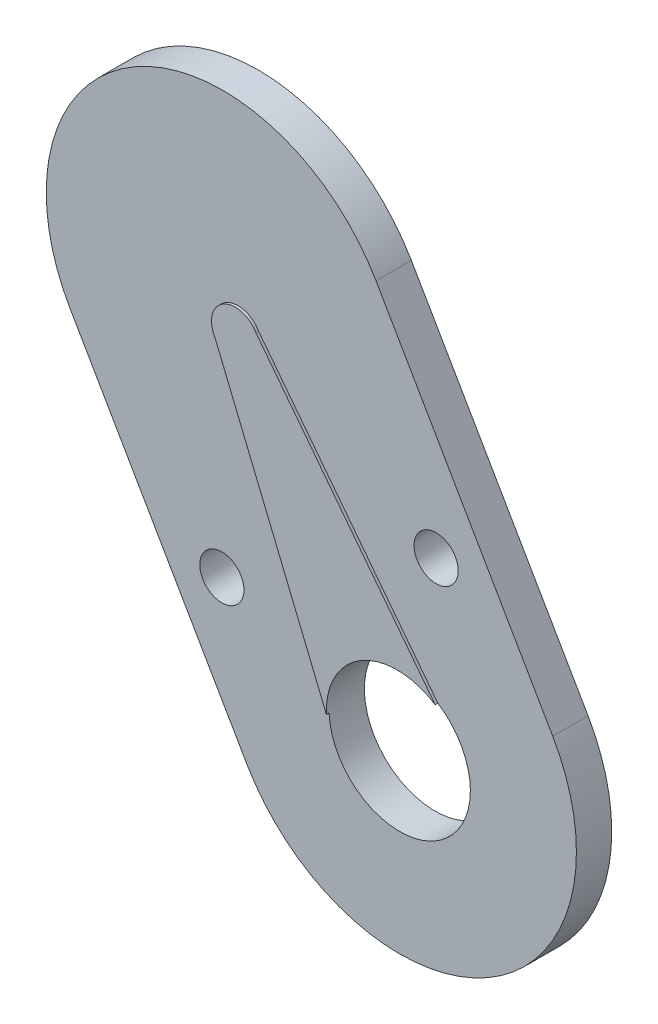
ISO-10303-21;
HEADER;
FILE_DESCRIPTION(('STEP AP214'),'2;1');
FILE_NAME('part.step','',(''),(''),'','','');
FILE_SCHEMA(('AUTOMOTIVE_DESIGN { 1 0 10303 214 1 1 1 1 }'));
ENDSEC;
DATA;
#1=APPLICATION_CONTEXT('core data for automotive mechanical design processes');
#2=APPLICATION_PROTOCOL_DEFINITION('international standard','automotive_design',2000,#1);
#3=PRODUCT_CONTEXT('',#1,'mechanical');
#4=PRODUCT('Part','Part','',(#3));
#5=PRODUCT_RELATED_PRODUCT_CATEGORY('part','',(#4));
#6=PRODUCT_DEFINITION_FORMATION('','',#4);
#7=PRODUCT_DEFINITION_CONTEXT('part definition',#1,'design');
#8=PRODUCT_DEFINITION('design','',#6,#7);
#9=PRODUCT_DEFINITION_SHAPE('','',#8);
#10=(LENGTH_UNIT() NAMED_UNIT(*) SI_UNIT(.MILLI.,.METRE.));
#11=(NAMED_UNIT(*) PLANE_ANGLE_UNIT() SI_UNIT($,.RADIAN.));
#12=(NAMED_UNIT(*) SI_UNIT($,.STERADIAN.) SOLID_ANGLE_UNIT());
#13=UNCERTAINTY_MEASURE_WITH_UNIT(LENGTH_MEASURE(1.E-05),#10,'distance_accuracy_value','');
#14=(GEOMETRIC_REPRESENTATION_CONTEXT(3) GLOBAL_UNCERTAINTY_ASSIGNED_CONTEXT((#13)) GLOBAL_UNIT_ASSIGNED_CONTEXT((#10,
#11,#12)) REPRESENTATION_CONTEXT('',''));
#15=CARTESIAN_POINT('',(0.,0.,0.));
#16=DIRECTION('',(0.,0.,1.));
#17=DIRECTION('',(1.,0.,0.));
#18=AXIS2_PLACEMENT_3D('',#15,#16,#17);
#19=CARTESIAN_POINT('',(3.29089653438087,1.9,0.15));
#20=DIRECTION('',(-0.792019043107697,-0.610496384391233,0.));
#21=DIRECTION('',(0.610496384391233,-0.792019043107697,0.));
#22=AXIS2_PLACEMENT_3D('',#19,#20,#21);
#23=PLANE('',#22);
#24=DIRECTION('',(0.,0.,-1.));
#25=VECTOR('',#24,1.);
#26=CARTESIAN_POINT('',(2.16075186307974,3.36617756308211,0.4));
#27=LINE('',#26,#25);
#28=CARTESIAN_POINT('',(2.16075186307974,3.36617756308211,0.));
#29=VERTEX_POINT('',#28);
#30=CARTESIAN_POINT('',(2.16075186307974,3.36617756308211,0.15));
#31=VERTEX_POINT('',#30);
#32=EDGE_CURVE('E57',#29,#31,#27,.F.);
#33=ORIENTED_EDGE('',*,*,#32,.F.);
#34=DIRECTION('',(-0.610496384391233,0.792019043107697,0.));
#35=VECTOR('',#34,1.);
#36=CARTESIAN_POINT('',(3.29089653438087,1.9,0.));
#37=LINE('',#36,#35);
#38=CARTESIAN_POINT('',(-7.98086570489101,16.5232648892552,0.));
#39=VERTEX_POINT('',#38);
#40=EDGE_CURVE('E129',#29,#39,#37,.T.);
#41=ORIENTED_EDGE('',*,*,#40,.T.);
#42=DIRECTION('',(0.,0.,-1.));
#43=VECTOR('',#42,1.);
#44=CARTESIAN_POINT('',(-7.98086570489101,16.5232648892552,0.15));
#45=LINE('',#44,#43);
#46=CARTESIAN_POINT('',(-7.98086570489101,16.5232648892552,0.15));
#47=VERTEX_POINT('',#46);
#48=EDGE_CURVE('E124',#47,#39,#45,.T.);
#49=ORIENTED_EDGE('',*,*,#48,.F.);
#50=DIRECTION('',(-0.610496384391233,0.792019043107697,0.));
#51=VECTOR('',#50,1.);
#52=CARTESIAN_POINT('',(3.29089653438087,1.9,0.15));
#53=LINE('',#52,#51);
#54=EDGE_CURVE('E125',#31,#47,#53,.T.);
#55=ORIENTED_EDGE('',*,*,#54,.F.);
#56=EDGE_LOOP('',(#33,#41,#49,#55));
#57=FACE_BOUND('',#56,.T.);
#58=ADVANCED_FACE('F39',(#57),#23,.F.);
#59=CARTESIAN_POINT('',(-10.319134295109,15.1732648892552,0.15));
#60=DIRECTION('',(0.924714899355206,0.380660419416691,0.));
#61=DIRECTION('',(-0.380660419416692,0.924714899355206,0.));
#62=AXIS2_PLACEMENT_3D('',#59,#60,#61);
#63=PLANE('',#62);
#64=DIRECTION('',(0.,0.,-1.));
#65=VECTOR('',#64,1.);
#66=CARTESIAN_POINT('',(-3.99557121481817,-0.188177223160556,0.4));
#67=LINE('',#66,#65);
#68=CARTESIAN_POINT('',(-3.99557121481817,-0.188177223160562,0.15));
#69=VERTEX_POINT('',#68);
#70=CARTESIAN_POINT('',(-3.99557121481817,-0.188177223160556,0.));
#71=VERTEX_POINT('',#70);
#72=EDGE_CURVE('E110',#69,#71,#67,.T.);
#73=ORIENTED_EDGE('',*,*,#72,.F.);
#74=DIRECTION('',(0.380660419416691,-0.924714899355206,0.));
#75=VECTOR('',#74,1.);
#76=CARTESIAN_POINT('',(-10.319134295109,15.1732648892552,0.15));
#77=LINE('',#76,#75);
#78=CARTESIAN_POINT('',(-10.319134295109,15.1732648892552,0.15));
#79=VERTEX_POINT('',#78);
#80=EDGE_CURVE('E114',#79,#69,#77,.T.);
#81=ORIENTED_EDGE('',*,*,#80,.F.);
#82=DIRECTION('',(0.,0.,-1.));
#83=VECTOR('',#82,1.);
#84=CARTESIAN_POINT('',(-10.319134295109,15.1732648892552,0.15));
#85=LINE('',#84,#83);
#86=CARTESIAN_POINT('',(-10.319134295109,15.1732648892552,0.));
#87=VERTEX_POINT('',#86);
#88=EDGE_CURVE('E122',#79,#87,#85,.T.);
#89=ORIENTED_EDGE('',*,*,#88,.T.);
#90=DIRECTION('',(0.380660419416691,-0.924714899355206,0.));
#91=VECTOR('',#90,1.);
#92=CARTESIAN_POINT('',(-10.319134295109,15.1732648892552,0.));
#93=LINE('',#92,#91);
#94=EDGE_CURVE('E64',#87,#71,#93,.T.);
#95=ORIENTED_EDGE('',*,*,#94,.T.);
#96=EDGE_LOOP('',(#73,#81,#89,#95));
#97=FACE_BOUND('',#96,.T.);
#98=ADVANCED_FACE('F115',(#97),#63,.F.);
#99=CARTESIAN_POINT('',(0.,0.,0.));
#100=DIRECTION('',(0.,0.,1.));
#101=DIRECTION('',(1.,0.,0.));
#102=AXIS2_PLACEMENT_3D('',#99,#100,#101);
#103=PLANE('',#102);
#104=CARTESIAN_POINT('',(2.06217782649107,10.4282032302755,0.));
#105=DIRECTION('',(0.,0.,1.));
#106=DIRECTION('',(1.,0.,0.));
#107=AXIS2_PLACEMENT_3D('',#104,#105,#106);
#108=CIRCLE('',#107,1.25);
#109=CARTESIAN_POINT('',(3.31217782649107,10.4282032302755,0.));
#110=VERTEX_POINT('',#109);
#111=EDGE_CURVE('E113',#110,#110,#108,.F.);
#112=ORIENTED_EDGE('',*,*,#111,.T.);
#113=EDGE_LOOP('',(#112));
#114=FACE_BOUND('',#113,.T.);
#115=CARTESIAN_POINT('',(-10.0621778264911,3.42820323027551,0.));
#116=DIRECTION('',(0.,0.,1.));
#117=DIRECTION('',(1.,0.,0.));
#118=AXIS2_PLACEMENT_3D('',#115,#116,#117);
#119=CIRCLE('',#118,1.25);
#120=CARTESIAN_POINT('',(-8.81217782649107,3.42820323027551,0.));
#121=VERTEX_POINT('',#120);
#122=EDGE_CURVE('E167',#121,#121,#119,.F.);
#123=ORIENTED_EDGE('',*,*,#122,.T.);
#124=EDGE_LOOP('',(#123));
#125=FACE_BOUND('',#124,.T.);
#126=DIRECTION('',(-0.5,0.866025403784439,0.));
#127=VECTOR('',#126,1.);
#128=CARTESIAN_POINT('',(8.66025403784439,5.,0.));
#129=LINE('',#128,#127);
#130=CARTESIAN_POINT('',(8.66025403784439,5.,0.));
#131=VERTEX_POINT('',#130);
#132=CARTESIAN_POINT('',(-1.33974596215561,22.3205080756888,0.));
#133=VERTEX_POINT('',#132);
#134=EDGE_CURVE('E148',#131,#133,#129,.T.);
#135=ORIENTED_EDGE('',*,*,#134,.T.);
#136=CARTESIAN_POINT('',(-10.,17.3205080756888,0.));
#137=DIRECTION('',(0.,0.,1.));
#138=DIRECTION('',(1.,0.,0.));
#139=AXIS2_PLACEMENT_3D('',#136,#137,#138);
#140=CIRCLE('',#139,10.);
#141=CARTESIAN_POINT('',(-18.6602540378444,12.3205080756888,0.));
#142=VERTEX_POINT('',#141);
#143=EDGE_CURVE('E135',#133,#142,#140,.T.);
#144=ORIENTED_EDGE('',*,*,#143,.T.);
#145=DIRECTION('',(0.5,-0.866025403784439,0.));
#146=VECTOR('',#145,1.);
#147=CARTESIAN_POINT('',(-18.6602540378444,12.3205080756888,0.));
#148=LINE('',#147,#146);
#149=CARTESIAN_POINT('',(-8.66025403784439,-5.,0.));
#150=VERTEX_POINT('',#149);
#151=EDGE_CURVE('E149',#142,#150,#148,.T.);
#152=ORIENTED_EDGE('',*,*,#151,.T.);
#153=CARTESIAN_POINT('',(0.,0.,0.));
#154=DIRECTION('',(0.,0.,1.));
#155=DIRECTION('',(1.,0.,0.));
#156=AXIS2_PLACEMENT_3D('',#153,#154,#155);
#157=CIRCLE('',#156,10.);
#158=EDGE_CURVE('E136',#150,#131,#157,.T.);
#159=ORIENTED_EDGE('',*,*,#158,.T.);
#160=EDGE_LOOP('',(#135,#144,#152,#159));
#161=FACE_BOUND('',#160,.T.);
#162=ORIENTED_EDGE('',*,*,#40,.F.);
#163=CARTESIAN_POINT('',(0.,0.,0.));
#164=DIRECTION('',(0.,0.,1.));
#165=DIRECTION('',(1.,0.,0.));
#166=AXIS2_PLACEMENT_3D('',#163,#164,#165);
#167=CIRCLE('',#166,4.);
#168=EDGE_CURVE('E178',#29,#71,#167,.F.);
#169=ORIENTED_EDGE('',*,*,#168,.T.);
#170=ORIENTED_EDGE('',*,*,#94,.F.);
#171=CARTESIAN_POINT('',(-9.15,15.8482648892552,0.));
#172=DIRECTION('',(0.,0.,1.));
#173=DIRECTION('',(1.,0.,0.));
#174=AXIS2_PLACEMENT_3D('',#171,#172,#173);
#175=CIRCLE('',#174,1.35);
#176=EDGE_CURVE('E181',#39,#87,#175,.T.);
#177=ORIENTED_EDGE('',*,*,#176,.F.);
#178=EDGE_LOOP('',(#162,#169,#170,#177));
#179=FACE_BOUND('',#178,.T.);
#180=ADVANCED_FACE('F188',(#114,#125,#161,#179),#103,.T.);
#181=CARTESIAN_POINT('',(8.66025403784439,5.,0.));
#182=DIRECTION('',(-0.866025403784439,-0.5,0.));
#183=DIRECTION('',(0.5,-0.866025403784439,0.));
#184=AXIS2_PLACEMENT_3D('',#181,#182,#183);
#185=PLANE('',#184);
#186=DIRECTION('',(-0.5,0.866025403784439,0.));
#187=VECTOR('',#186,1.);
#188=CARTESIAN_POINT('',(8.66025403784439,5.,-2.));
#189=LINE('',#188,#187);
#190=CARTESIAN_POINT('',(8.66025403784439,5.,-2.));
#191=VERTEX_POINT('',#190);
#192=CARTESIAN_POINT('',(-1.33974596215561,22.3205080756888,-2.));
#193=VERTEX_POINT('',#192);
#194=EDGE_CURVE('E141',#191,#193,#189,.T.);
#195=ORIENTED_EDGE('',*,*,#194,.T.);
#196=DIRECTION('',(0.,0.,-1.));
#197=VECTOR('',#196,1.);
#198=CARTESIAN_POINT('',(-1.33974596215561,22.3205080756888,0.));
#199=LINE('',#198,#197);
#200=EDGE_CURVE('E161',#133,#193,#199,.T.);
#201=ORIENTED_EDGE('',*,*,#200,.F.);
#202=ORIENTED_EDGE('',*,*,#134,.F.);
#203=DIRECTION('',(0.,0.,-1.));
#204=VECTOR('',#203,1.);
#205=CARTESIAN_POINT('',(8.66025403784439,5.,0.));
#206=LINE('',#205,#204);
#207=EDGE_CURVE('E48',#131,#191,#206,.T.);
#208=ORIENTED_EDGE('',*,*,#207,.T.);
#209=EDGE_LOOP('',(#195,#201,#202,#208));
#210=FACE_BOUND('',#209,.T.);
#211=ADVANCED_FACE('F41',(#210),#185,.F.);
#212=CARTESIAN_POINT('',(-18.6602540378444,12.3205080756888,0.));
#213=DIRECTION('',(0.866025403784439,0.5,0.));
#214=DIRECTION('',(-0.5,0.866025403784439,0.));
#215=AXIS2_PLACEMENT_3D('',#212,#213,#214);
#216=PLANE('',#215);
#217=DIRECTION('',(0.5,-0.866025403784439,0.));
#218=VECTOR('',#217,1.);
#219=CARTESIAN_POINT('',(-18.6602540378444,12.3205080756888,-2.));
#220=LINE('',#219,#218);
#221=CARTESIAN_POINT('',(-18.6602540378444,12.3205080756888,-2.));
#222=VERTEX_POINT('',#221);
#223=CARTESIAN_POINT('',(-8.66025403784439,-5.,-2.));
#224=VERTEX_POINT('',#223);
#225=EDGE_CURVE('E147',#222,#224,#220,.T.);
#226=ORIENTED_EDGE('',*,*,#225,.T.);
#227=DIRECTION('',(0.,0.,-1.));
#228=VECTOR('',#227,1.);
#229=CARTESIAN_POINT('',(-8.66025403784439,-5.,0.));
#230=LINE('',#229,#228);
#231=EDGE_CURVE('E155',#150,#224,#230,.T.);
#232=ORIENTED_EDGE('',*,*,#231,.F.);
#233=ORIENTED_EDGE('',*,*,#151,.F.);
#234=DIRECTION('',(0.,0.,-1.));
#235=VECTOR('',#234,1.);
#236=CARTESIAN_POINT('',(-18.6602540378444,12.3205080756888,0.));
#237=LINE('',#236,#235);
#238=EDGE_CURVE('E158',#142,#222,#237,.T.);
#239=ORIENTED_EDGE('',*,*,#238,.T.);
#240=EDGE_LOOP('',(#226,#232,#233,#239));
#241=FACE_BOUND('',#240,.T.);
#242=ADVANCED_FACE('F213',(#241),#216,.F.);
#243=CARTESIAN_POINT('',(0.,0.,-2.));
#244=DIRECTION('',(0.,0.,1.));
#245=DIRECTION('',(1.,0.,0.));
#246=AXIS2_PLACEMENT_3D('',#243,#244,#245);
#247=PLANE('',#246);
#248=CARTESIAN_POINT('',(2.06217782649107,10.4282032302755,-2.));
#249=DIRECTION('',(0.,0.,1.));
#250=DIRECTION('',(1.,0.,0.));
#251=AXIS2_PLACEMENT_3D('',#248,#249,#250);
#252=CIRCLE('',#251,1.25);
#253=CARTESIAN_POINT('',(3.31217782649107,10.4282032302755,-2.));
#254=VERTEX_POINT('',#253);
#255=EDGE_CURVE('E43',#254,#254,#252,.F.);
#256=ORIENTED_EDGE('',*,*,#255,.F.);
#257=EDGE_LOOP('',(#256));
#258=FACE_BOUND('',#257,.T.);
#259=CARTESIAN_POINT('',(-10.0621778264911,3.42820323027551,-2.));
#260=DIRECTION('',(0.,0.,1.));
#261=DIRECTION('',(1.,0.,0.));
#262=AXIS2_PLACEMENT_3D('',#259,#260,#261);
#263=CIRCLE('',#262,1.25);
#264=CARTESIAN_POINT('',(-8.81217782649107,3.42820323027551,-2.));
#265=VERTEX_POINT('',#264);
#266=EDGE_CURVE('E163',#265,#265,#263,.F.);
#267=ORIENTED_EDGE('',*,*,#266,.F.);
#268=EDGE_LOOP('',(#267));
#269=FACE_BOUND('',#268,.T.);
#270=CARTESIAN_POINT('',(0.,0.,-2.));
#271=DIRECTION('',(0.,0.,1.));
#272=DIRECTION('',(1.,0.,0.));
#273=AXIS2_PLACEMENT_3D('',#270,#271,#272);
#274=CIRCLE('',#273,4.);
#275=CARTESIAN_POINT('',(4.,0.,-2.));
#276=VERTEX_POINT('',#275);
#277=EDGE_CURVE('E176',#276,#276,#274,.F.);
#278=ORIENTED_EDGE('',*,*,#277,.F.);
#279=EDGE_LOOP('',(#278));
#280=FACE_BOUND('',#279,.T.);
#281=ORIENTED_EDGE('',*,*,#225,.F.);
#282=CARTESIAN_POINT('',(-10.,17.3205080756888,-2.));
#283=DIRECTION('',(0.,0.,1.));
#284=DIRECTION('',(1.,0.,0.));
#285=AXIS2_PLACEMENT_3D('',#282,#283,#284);
#286=CIRCLE('',#285,10.);
#287=EDGE_CURVE('E133',#193,#222,#286,.T.);
#288=ORIENTED_EDGE('',*,*,#287,.F.);
#289=ORIENTED_EDGE('',*,*,#194,.F.);
#290=CARTESIAN_POINT('',(0.,0.,-2.));
#291=DIRECTION('',(0.,0.,1.));
#292=DIRECTION('',(1.,0.,0.));
#293=AXIS2_PLACEMENT_3D('',#290,#291,#292);
#294=CIRCLE('',#293,10.);
#295=EDGE_CURVE('E138',#224,#191,#294,.T.);
#296=ORIENTED_EDGE('',*,*,#295,.F.);
#297=EDGE_LOOP('',(#281,#288,#289,#296));
#298=FACE_BOUND('',#297,.T.);
#299=ADVANCED_FACE('F210',(#258,#269,#280,#298),#247,.F.);
#300=CARTESIAN_POINT('',(0.,0.,0.));
#301=DIRECTION('',(0.,0.,-1.));
#302=DIRECTION('',(-1.,0.,0.));
#303=AXIS2_PLACEMENT_3D('',#300,#301,#302);
#304=CYLINDRICAL_SURFACE('',#303,10.);
#305=ORIENTED_EDGE('',*,*,#295,.T.);
#306=ORIENTED_EDGE('',*,*,#207,.F.);
#307=ORIENTED_EDGE('',*,*,#158,.F.);
#308=ORIENTED_EDGE('',*,*,#231,.T.);
#309=EDGE_LOOP('',(#305,#306,#307,#308));
#310=FACE_BOUND('',#309,.T.);
#311=ADVANCED_FACE('F201',(#310),#304,.T.);
#312=CARTESIAN_POINT('',(-10.,17.3205080756888,0.));
#313=DIRECTION('',(0.,0.,-1.));
#314=DIRECTION('',(-1.,0.,0.));
#315=AXIS2_PLACEMENT_3D('',#312,#313,#314);
#316=CYLINDRICAL_SURFACE('',#315,10.);
#317=ORIENTED_EDGE('',*,*,#143,.F.);
#318=ORIENTED_EDGE('',*,*,#200,.T.);
#319=ORIENTED_EDGE('',*,*,#287,.T.);
#320=ORIENTED_EDGE('',*,*,#238,.F.);
#321=EDGE_LOOP('',(#317,#318,#319,#320));
#322=FACE_BOUND('',#321,.T.);
#323=ADVANCED_FACE('F199',(#322),#316,.T.);
#324=CARTESIAN_POINT('',(0.,0.,0.15));
#325=DIRECTION('',(0.,0.,1.));
#326=DIRECTION('',(1.,0.,0.));
#327=AXIS2_PLACEMENT_3D('',#324,#325,#326);
#328=PLANE('',#327);
#329=ORIENTED_EDGE('',*,*,#80,.T.);
#330=CARTESIAN_POINT('',(0.,0.,0.15));
#331=DIRECTION('',(0.,0.,1.));
#332=DIRECTION('',(1.,0.,0.));
#333=AXIS2_PLACEMENT_3D('',#330,#331,#332);
#334=CIRCLE('',#333,4.);
#335=EDGE_CURVE('E11',#69,#31,#334,.F.);
#336=ORIENTED_EDGE('',*,*,#335,.T.);
#337=ORIENTED_EDGE('',*,*,#54,.T.);
#338=CARTESIAN_POINT('',(-9.15,15.8482648892552,0.15));
#339=DIRECTION('',(0.,0.,1.));
#340=DIRECTION('',(1.,0.,0.));
#341=AXIS2_PLACEMENT_3D('',#338,#339,#340);
#342=CIRCLE('',#341,1.35);
#343=EDGE_CURVE('E120',#47,#79,#342,.T.);
#344=ORIENTED_EDGE('',*,*,#343,.T.);
#345=EDGE_LOOP('',(#329,#336,#337,#344));
#346=FACE_BOUND('',#345,.T.);
#347=ADVANCED_FACE('F119',(#346),#328,.T.);
#348=CARTESIAN_POINT('',(-9.15,15.8482648892552,0.15));
#349=DIRECTION('',(0.,0.,-1.));
#350=DIRECTION('',(-1.,0.,0.));
#351=AXIS2_PLACEMENT_3D('',#348,#349,#350);
#352=CYLINDRICAL_SURFACE('',#351,1.35);
#353=ORIENTED_EDGE('',*,*,#176,.T.);
#354=ORIENTED_EDGE('',*,*,#88,.F.);
#355=ORIENTED_EDGE('',*,*,#343,.F.);
#356=ORIENTED_EDGE('',*,*,#48,.T.);
#357=EDGE_LOOP('',(#353,#354,#355,#356));
#358=FACE_BOUND('',#357,.T.);
#359=ADVANCED_FACE('F186',(#358),#352,.T.);
#360=CARTESIAN_POINT('',(0.,0.,0.4));
#361=DIRECTION('',(0.,0.,-1.));
#362=DIRECTION('',(-1.,0.,0.));
#363=AXIS2_PLACEMENT_3D('',#360,#361,#362);
#364=CYLINDRICAL_SURFACE('',#363,4.);
#365=ORIENTED_EDGE('',*,*,#32,.T.);
#366=ORIENTED_EDGE('',*,*,#335,.F.);
#367=ORIENTED_EDGE('',*,*,#72,.T.);
#368=ORIENTED_EDGE('',*,*,#168,.F.);
#369=EDGE_LOOP('',(#365,#366,#367,#368));
#370=FACE_BOUND('',#369,.T.);
#371=ORIENTED_EDGE('',*,*,#277,.T.);
#372=EDGE_LOOP('',(#371));
#373=FACE_BOUND('',#372,.T.);
#374=ADVANCED_FACE('F104',(#370,#373),#364,.F.);
#375=CARTESIAN_POINT('',(-10.0621778264911,3.42820323027551,0.4));
#376=DIRECTION('',(0.,0.,-1.));
#377=DIRECTION('',(-1.,0.,0.));
#378=AXIS2_PLACEMENT_3D('',#375,#376,#377);
#379=CYLINDRICAL_SURFACE('',#378,1.25);
#380=ORIENTED_EDGE('',*,*,#122,.F.);
#381=EDGE_LOOP('',(#380));
#382=FACE_BOUND('',#381,.T.);
#383=ORIENTED_EDGE('',*,*,#266,.T.);
#384=EDGE_LOOP('',(#383));
#385=FACE_BOUND('',#384,.T.);
#386=ADVANCED_FACE('F290',(#382,#385),#379,.F.);
#387=CARTESIAN_POINT('',(2.06217782649107,10.4282032302755,0.4));
#388=DIRECTION('',(0.,0.,-1.));
#389=DIRECTION('',(-1.,0.,0.));
#390=AXIS2_PLACEMENT_3D('',#387,#388,#389);
#391=CYLINDRICAL_SURFACE('',#390,1.25);
#392=ORIENTED_EDGE('',*,*,#111,.F.);
#393=EDGE_LOOP('',(#392));
#394=FACE_BOUND('',#393,.T.);
#395=ORIENTED_EDGE('',*,*,#255,.T.);
#396=EDGE_LOOP('',(#395));
#397=FACE_BOUND('',#396,.T.);
#398=ADVANCED_FACE('F309',(#394,#397),#391,.F.);
#399=CLOSED_SHELL('',(#58,#98,#180,#211,#242,#299,#311,#323,#347,#359,#374,#386,#398));
#400=MANIFOLD_SOLID_BREP('B2',#399);
#401=ADVANCED_BREP_SHAPE_REPRESENTATION('',(#18,#400),#14);
#402=SHAPE_DEFINITION_REPRESENTATION(#9,#401);
ENDSEC;
END-ISO-10303-21;
